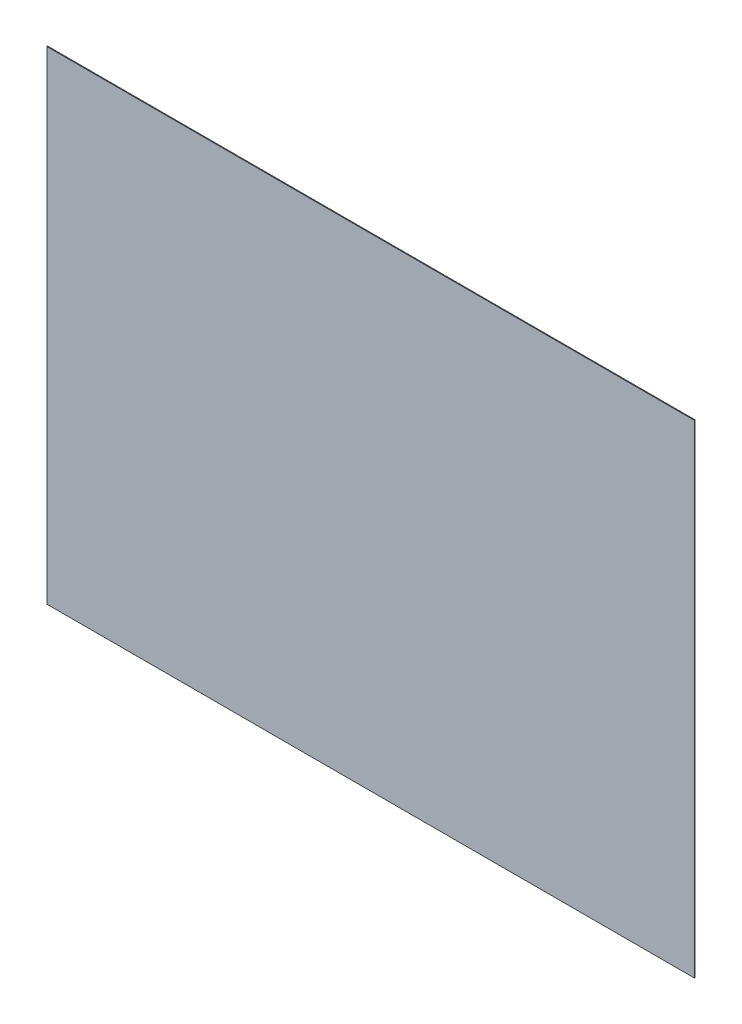
ISO-10303-21;
HEADER;
FILE_DESCRIPTION(('STEP AP214'),'2;1');
FILE_NAME('part.step','',(''),(''),'','','');
FILE_SCHEMA(('AUTOMOTIVE_DESIGN { 1 0 10303 214 1 1 1 1 }'));
ENDSEC;
DATA;
#1=APPLICATION_CONTEXT('core data for automotive mechanical design processes');
#2=APPLICATION_PROTOCOL_DEFINITION('international standard','automotive_design',2000,#1);
#3=PRODUCT_CONTEXT('',#1,'mechanical');
#4=PRODUCT('Part','Part','',(#3));
#5=PRODUCT_RELATED_PRODUCT_CATEGORY('part','',(#4));
#6=PRODUCT_DEFINITION_FORMATION('','',#4);
#7=PRODUCT_DEFINITION_CONTEXT('part definition',#1,'design');
#8=PRODUCT_DEFINITION('design','',#6,#7);
#9=PRODUCT_DEFINITION_SHAPE('','',#8);
#10=(LENGTH_UNIT() NAMED_UNIT(*) SI_UNIT(.MILLI.,.METRE.));
#11=(NAMED_UNIT(*) PLANE_ANGLE_UNIT() SI_UNIT($,.RADIAN.));
#12=(NAMED_UNIT(*) SI_UNIT($,.STERADIAN.) SOLID_ANGLE_UNIT());
#13=UNCERTAINTY_MEASURE_WITH_UNIT(LENGTH_MEASURE(1.E-05),#10,'distance_accuracy_value','');
#14=(GEOMETRIC_REPRESENTATION_CONTEXT(3) GLOBAL_UNCERTAINTY_ASSIGNED_CONTEXT((#13)) GLOBAL_UNIT_ASSIGNED_CONTEXT((#10,
#11,#12)) REPRESENTATION_CONTEXT('',''));
#15=CARTESIAN_POINT('',(0.,0.,0.));
#16=DIRECTION('',(0.,0.,1.));
#17=DIRECTION('',(1.,0.,0.));
#18=AXIS2_PLACEMENT_3D('',#15,#16,#17);
#19=CARTESIAN_POINT('',(0.,0.,15.));
#20=DIRECTION('',(1.,0.,0.));
#21=DIRECTION('',(0.,0.,-1.));
#22=AXIS2_PLACEMENT_3D('',#19,#20,#21);
#23=PLANE('',#22);
#24=DIRECTION('',(0.,-1.,0.));
#25=VECTOR('',#24,1.);
#26=CARTESIAN_POINT('',(0.,0.,0.));
#27=LINE('',#26,#25);
#28=CARTESIAN_POINT('',(0.,8950.,0.));
#29=VERTEX_POINT('',#28);
#30=CARTESIAN_POINT('',(0.,0.,0.));
#31=VERTEX_POINT('',#30);
#32=EDGE_CURVE('E104',#29,#31,#27,.T.);
#33=ORIENTED_EDGE('',*,*,#32,.T.);
#34=DIRECTION('',(0.,0.,-1.));
#35=VECTOR('',#34,1.);
#36=CARTESIAN_POINT('',(0.,0.,15.));
#37=LINE('',#36,#35);
#38=CARTESIAN_POINT('',(0.,0.,15.));
#39=VERTEX_POINT('',#38);
#40=EDGE_CURVE('E11',#39,#31,#37,.T.);
#41=ORIENTED_EDGE('',*,*,#40,.F.);
#42=DIRECTION('',(0.,-1.,0.));
#43=VECTOR('',#42,1.);
#44=CARTESIAN_POINT('',(0.,0.,15.));
#45=LINE('',#44,#43);
#46=CARTESIAN_POINT('',(0.,8950.,15.));
#47=VERTEX_POINT('',#46);
#48=EDGE_CURVE('E92',#47,#39,#45,.T.);
#49=ORIENTED_EDGE('',*,*,#48,.F.);
#50=DIRECTION('',(0.,0.,-1.));
#51=VECTOR('',#50,1.);
#52=CARTESIAN_POINT('',(0.,8950.,15.));
#53=LINE('',#52,#51);
#54=EDGE_CURVE('E100',#47,#29,#53,.T.);
#55=ORIENTED_EDGE('',*,*,#54,.T.);
#56=EDGE_LOOP('',(#33,#41,#49,#55));
#57=FACE_BOUND('',#56,.T.);
#58=ADVANCED_FACE('F41',(#57),#23,.F.);
#59=CARTESIAN_POINT('',(0.,0.,15.));
#60=DIRECTION('',(0.,1.,0.));
#61=DIRECTION('',(0.,0.,1.));
#62=AXIS2_PLACEMENT_3D('',#59,#60,#61);
#63=PLANE('',#62);
#64=DIRECTION('',(1.,0.,0.));
#65=VECTOR('',#64,1.);
#66=CARTESIAN_POINT('',(0.,0.,0.));
#67=LINE('',#66,#65);
#68=CARTESIAN_POINT('',(12000.,0.,0.));
#69=VERTEX_POINT('',#68);
#70=EDGE_CURVE('E96',#31,#69,#67,.T.);
#71=ORIENTED_EDGE('',*,*,#70,.T.);
#72=DIRECTION('',(0.,0.,-1.));
#73=VECTOR('',#72,1.);
#74=CARTESIAN_POINT('',(12000.,0.,15.));
#75=LINE('',#74,#73);
#76=CARTESIAN_POINT('',(12000.,0.,15.));
#77=VERTEX_POINT('',#76);
#78=EDGE_CURVE('E49',#77,#69,#75,.T.);
#79=ORIENTED_EDGE('',*,*,#78,.F.);
#80=DIRECTION('',(1.,0.,0.));
#81=VECTOR('',#80,1.);
#82=CARTESIAN_POINT('',(0.,0.,15.));
#83=LINE('',#82,#81);
#84=EDGE_CURVE('E87',#39,#77,#83,.T.);
#85=ORIENTED_EDGE('',*,*,#84,.F.);
#86=ORIENTED_EDGE('',*,*,#40,.T.);
#87=EDGE_LOOP('',(#71,#79,#85,#86));
#88=FACE_BOUND('',#87,.T.);
#89=ADVANCED_FACE('F95',(#88),#63,.F.);
#90=CARTESIAN_POINT('',(12000.,0.,15.));
#91=DIRECTION('',(-1.,0.,0.));
#92=DIRECTION('',(0.,0.,1.));
#93=AXIS2_PLACEMENT_3D('',#90,#91,#92);
#94=PLANE('',#93);
#95=DIRECTION('',(0.,1.,0.));
#96=VECTOR('',#95,1.);
#97=CARTESIAN_POINT('',(12000.,0.,0.));
#98=LINE('',#97,#96);
#99=CARTESIAN_POINT('',(12000.,8950.,0.));
#100=VERTEX_POINT('',#99);
#101=EDGE_CURVE('E74',#69,#100,#98,.T.);
#102=ORIENTED_EDGE('',*,*,#101,.T.);
#103=DIRECTION('',(0.,0.,-1.));
#104=VECTOR('',#103,1.);
#105=CARTESIAN_POINT('',(12000.,8950.,15.));
#106=LINE('',#105,#104);
#107=CARTESIAN_POINT('',(12000.,8950.,15.));
#108=VERTEX_POINT('',#107);
#109=EDGE_CURVE('E97',#108,#100,#106,.T.);
#110=ORIENTED_EDGE('',*,*,#109,.F.);
#111=DIRECTION('',(0.,1.,0.));
#112=VECTOR('',#111,1.);
#113=CARTESIAN_POINT('',(12000.,0.,15.));
#114=LINE('',#113,#112);
#115=EDGE_CURVE('E90',#77,#108,#114,.T.);
#116=ORIENTED_EDGE('',*,*,#115,.F.);
#117=ORIENTED_EDGE('',*,*,#78,.T.);
#118=EDGE_LOOP('',(#102,#110,#116,#117));
#119=FACE_BOUND('',#118,.T.);
#120=ADVANCED_FACE('F98',(#119),#94,.F.);
#121=CARTESIAN_POINT('',(0.,8950.,15.));
#122=DIRECTION('',(0.,-1.,0.));
#123=DIRECTION('',(0.,0.,-1.));
#124=AXIS2_PLACEMENT_3D('',#121,#122,#123);
#125=PLANE('',#124);
#126=DIRECTION('',(-1.,0.,0.));
#127=VECTOR('',#126,1.);
#128=CARTESIAN_POINT('',(0.,8950.,0.));
#129=LINE('',#128,#127);
#130=EDGE_CURVE('E80',#100,#29,#129,.T.);
#131=ORIENTED_EDGE('',*,*,#130,.T.);
#132=ORIENTED_EDGE('',*,*,#54,.F.);
#133=DIRECTION('',(-1.,0.,0.));
#134=VECTOR('',#133,1.);
#135=CARTESIAN_POINT('',(0.,8950.,15.));
#136=LINE('',#135,#134);
#137=EDGE_CURVE('E57',#108,#47,#136,.T.);
#138=ORIENTED_EDGE('',*,*,#137,.F.);
#139=ORIENTED_EDGE('',*,*,#109,.T.);
#140=EDGE_LOOP('',(#131,#132,#138,#139));
#141=FACE_BOUND('',#140,.T.);
#142=ADVANCED_FACE('F111',(#141),#125,.F.);
#143=CARTESIAN_POINT('',(0.,8950.,15.));
#144=DIRECTION('',(0.,0.,-1.));
#145=DIRECTION('',(-1.,0.,0.));
#146=AXIS2_PLACEMENT_3D('',#143,#144,#145);
#147=PLANE('',#146);
#148=ORIENTED_EDGE('',*,*,#48,.T.);
#149=ORIENTED_EDGE('',*,*,#84,.T.);
#150=ORIENTED_EDGE('',*,*,#115,.T.);
#151=ORIENTED_EDGE('',*,*,#137,.T.);
#152=EDGE_LOOP('',(#148,#149,#150,#151));
#153=FACE_BOUND('',#152,.T.);
#154=ADVANCED_FACE('F88',(#153),#147,.F.);
#155=CARTESIAN_POINT('',(0.,8950.,0.));
#156=DIRECTION('',(0.,0.,-1.));
#157=DIRECTION('',(-1.,0.,0.));
#158=AXIS2_PLACEMENT_3D('',#155,#156,#157);
#159=PLANE('',#158);
#160=ORIENTED_EDGE('',*,*,#32,.F.);
#161=ORIENTED_EDGE('',*,*,#130,.F.);
#162=ORIENTED_EDGE('',*,*,#101,.F.);
#163=ORIENTED_EDGE('',*,*,#70,.F.);
#164=EDGE_LOOP('',(#160,#161,#162,#163));
#165=FACE_BOUND('',#164,.T.);
#166=ADVANCED_FACE('F114',(#165),#159,.T.);
#167=CLOSED_SHELL('',(#58,#89,#120,#142,#154,#166));
#168=MANIFOLD_SOLID_BREP('B2',#167);
#169=ADVANCED_BREP_SHAPE_REPRESENTATION('',(#18,#168),#14);
#170=SHAPE_DEFINITION_REPRESENTATION(#9,#169);
ENDSEC;
END-ISO-10303-21;
